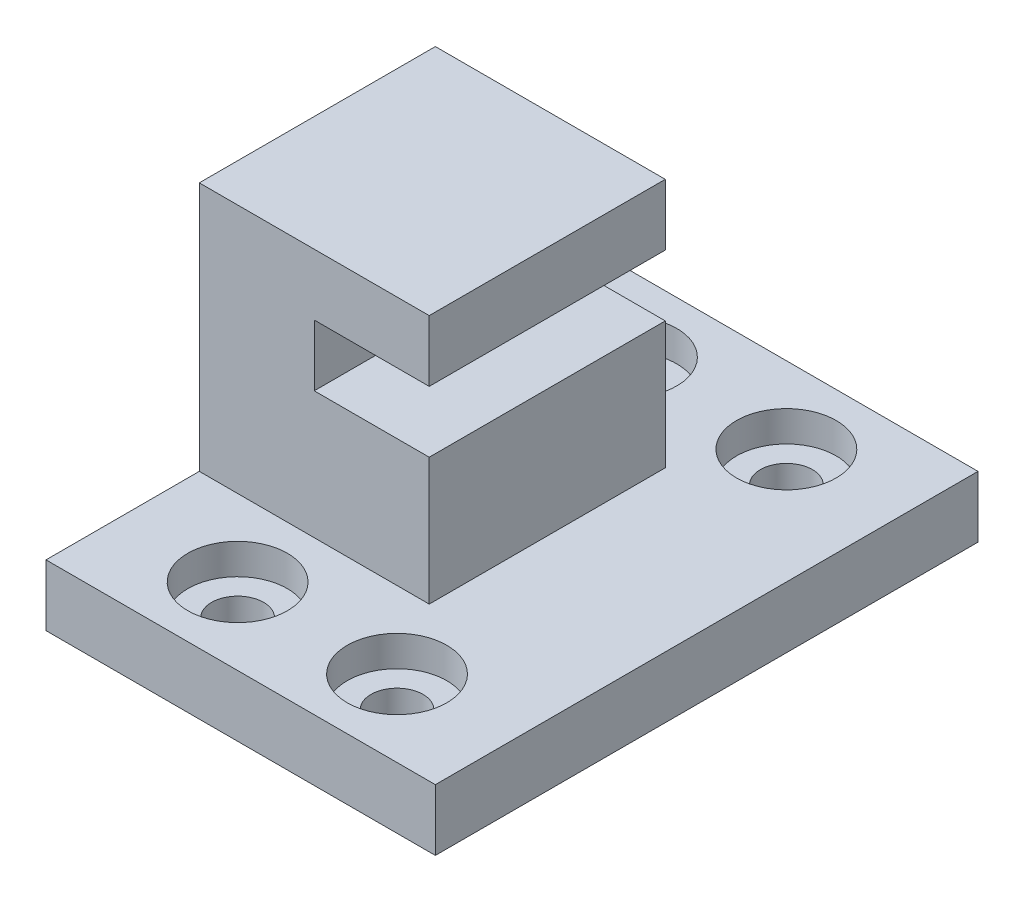
ISO-10303-21;
HEADER;
FILE_DESCRIPTION(('STEP AP214'),'2;1');
FILE_NAME('part.step','',(''),(''),'','','');
FILE_SCHEMA(('AUTOMOTIVE_DESIGN { 1 0 10303 214 1 1 1 1 }'));
ENDSEC;
DATA;
#1=APPLICATION_CONTEXT('core data for automotive mechanical design processes');
#2=APPLICATION_PROTOCOL_DEFINITION('international standard','automotive_design',2000,#1);
#3=PRODUCT_CONTEXT('',#1,'mechanical');
#4=PRODUCT('Part','Part','',(#3));
#5=PRODUCT_RELATED_PRODUCT_CATEGORY('part','',(#4));
#6=PRODUCT_DEFINITION_FORMATION('','',#4);
#7=PRODUCT_DEFINITION_CONTEXT('part definition',#1,'design');
#8=PRODUCT_DEFINITION('design','',#6,#7);
#9=PRODUCT_DEFINITION_SHAPE('','',#8);
#10=(LENGTH_UNIT() NAMED_UNIT(*) SI_UNIT(.MILLI.,.METRE.));
#11=(NAMED_UNIT(*) PLANE_ANGLE_UNIT() SI_UNIT($,.RADIAN.));
#12=(NAMED_UNIT(*) SI_UNIT($,.STERADIAN.) SOLID_ANGLE_UNIT());
#13=UNCERTAINTY_MEASURE_WITH_UNIT(LENGTH_MEASURE(1.E-05),#10,'distance_accuracy_value','');
#14=(GEOMETRIC_REPRESENTATION_CONTEXT(3) GLOBAL_UNCERTAINTY_ASSIGNED_CONTEXT((#13)) GLOBAL_UNIT_ASSIGNED_CONTEXT((#10,
#11,#12)) REPRESENTATION_CONTEXT('',''));
#15=CARTESIAN_POINT('',(0.,0.,0.));
#16=DIRECTION('',(0.,0.,1.));
#17=DIRECTION('',(1.,0.,0.));
#18=AXIS2_PLACEMENT_3D('',#15,#16,#17);
#19=CARTESIAN_POINT('',(2.3,20.3,-7.7));
#20=DIRECTION('',(-1.,0.,0.));
#21=DIRECTION('',(0.,0.,1.));
#22=AXIS2_PLACEMENT_3D('',#19,#20,#21);
#23=PLANE('',#22);
#24=DIRECTION('',(0.,-1.,0.));
#25=VECTOR('',#24,1.);
#26=CARTESIAN_POINT('',(2.3,20.3,-7.7));
#27=LINE('',#26,#25);
#28=CARTESIAN_POINT('',(2.3,12.3,-7.7));
#29=VERTEX_POINT('',#28);
#30=CARTESIAN_POINT('',(2.3,4.,-7.7));
#31=VERTEX_POINT('',#30);
#32=EDGE_CURVE('E64',#29,#31,#27,.T.);
#33=ORIENTED_EDGE('',*,*,#32,.F.);
#34=DIRECTION('',(0.,0.,1.));
#35=VECTOR('',#34,1.);
#36=CARTESIAN_POINT('',(2.3,12.3,-17.7));
#37=LINE('',#36,#35);
#38=CARTESIAN_POINT('',(2.3,12.3,7.7));
#39=VERTEX_POINT('',#38);
#40=EDGE_CURVE('E202',#29,#39,#37,.T.);
#41=ORIENTED_EDGE('',*,*,#40,.T.);
#42=DIRECTION('',(0.,-1.,0.));
#43=VECTOR('',#42,1.);
#44=CARTESIAN_POINT('',(2.3,20.3,7.7));
#45=LINE('',#44,#43);
#46=CARTESIAN_POINT('',(2.3,4.,7.7));
#47=VERTEX_POINT('',#46);
#48=EDGE_CURVE('E157',#39,#47,#45,.T.);
#49=ORIENTED_EDGE('',*,*,#48,.T.);
#50=DIRECTION('',(0.,0.,-1.));
#51=VECTOR('',#50,1.);
#52=CARTESIAN_POINT('',(2.3,4.,-7.7));
#53=LINE('',#52,#51);
#54=EDGE_CURVE('E222',#47,#31,#53,.T.);
#55=ORIENTED_EDGE('',*,*,#54,.T.);
#56=EDGE_LOOP('',(#33,#41,#49,#55));
#57=FACE_BOUND('',#56,.T.);
#58=ADVANCED_FACE('F42',(#57),#23,.F.);
#59=CARTESIAN_POINT('',(-12.7,4.,17.7));
#60=DIRECTION('',(1.,0.,0.));
#61=DIRECTION('',(0.,0.,-1.));
#62=AXIS2_PLACEMENT_3D('',#59,#60,#61);
#63=PLANE('',#62);
#64=DIRECTION('',(0.,0.,1.));
#65=VECTOR('',#64,1.);
#66=CARTESIAN_POINT('',(-12.7,0.,17.7));
#67=LINE('',#66,#65);
#68=CARTESIAN_POINT('',(-12.7,0.,-17.7));
#69=VERTEX_POINT('',#68);
#70=CARTESIAN_POINT('',(-12.7,0.,17.7));
#71=VERTEX_POINT('',#70);
#72=EDGE_CURVE('E160',#69,#71,#67,.T.);
#73=ORIENTED_EDGE('',*,*,#72,.T.);
#74=DIRECTION('',(0.,-1.,0.));
#75=VECTOR('',#74,1.);
#76=CARTESIAN_POINT('',(-12.7,4.,17.7));
#77=LINE('',#76,#75);
#78=CARTESIAN_POINT('',(-12.7,4.,17.7));
#79=VERTEX_POINT('',#78);
#80=EDGE_CURVE('E192',#79,#71,#77,.T.);
#81=ORIENTED_EDGE('',*,*,#80,.F.);
#82=DIRECTION('',(0.,0.,1.));
#83=VECTOR('',#82,1.);
#84=CARTESIAN_POINT('',(-12.7,4.,17.7));
#85=LINE('',#84,#83);
#86=CARTESIAN_POINT('',(-12.7,4.,7.7));
#87=VERTEX_POINT('',#86);
#88=EDGE_CURVE('E169',#87,#79,#85,.T.);
#89=ORIENTED_EDGE('',*,*,#88,.F.);
#90=DIRECTION('',(0.,-1.,0.));
#91=VECTOR('',#90,1.);
#92=CARTESIAN_POINT('',(-12.7,20.3,7.7));
#93=LINE('',#92,#91);
#94=CARTESIAN_POINT('',(-12.7,20.3,7.7));
#95=VERTEX_POINT('',#94);
#96=EDGE_CURVE('E156',#95,#87,#93,.T.);
#97=ORIENTED_EDGE('',*,*,#96,.F.);
#98=DIRECTION('',(0.,0.,1.));
#99=VECTOR('',#98,1.);
#100=CARTESIAN_POINT('',(-12.7,20.3,-7.7));
#101=LINE('',#100,#99);
#102=CARTESIAN_POINT('',(-12.7,20.3,-7.7));
#103=VERTEX_POINT('',#102);
#104=EDGE_CURVE('E210',#103,#95,#101,.T.);
#105=ORIENTED_EDGE('',*,*,#104,.F.);
#106=DIRECTION('',(0.,-1.,0.));
#107=VECTOR('',#106,1.);
#108=CARTESIAN_POINT('',(-12.7,20.3,-7.7));
#109=LINE('',#108,#107);
#110=CARTESIAN_POINT('',(-12.7,4.,-7.7));
#111=VERTEX_POINT('',#110);
#112=EDGE_CURVE('E219',#103,#111,#109,.T.);
#113=ORIENTED_EDGE('',*,*,#112,.T.);
#114=CARTESIAN_POINT('',(-12.7,4.,-17.7));
#115=VERTEX_POINT('',#114);
#116=EDGE_CURVE('E166',#115,#111,#85,.T.);
#117=ORIENTED_EDGE('',*,*,#116,.F.);
#118=DIRECTION('',(0.,-1.,0.));
#119=VECTOR('',#118,1.);
#120=CARTESIAN_POINT('',(-12.7,4.,-17.7));
#121=LINE('',#120,#119);
#122=EDGE_CURVE('E175',#115,#69,#121,.T.);
#123=ORIENTED_EDGE('',*,*,#122,.T.);
#124=EDGE_LOOP('',(#73,#81,#89,#97,#105,#113,#117,#123));
#125=FACE_BOUND('',#124,.T.);
#126=ADVANCED_FACE('F235',(#125),#63,.F.);
#127=CARTESIAN_POINT('',(-12.7,4.,17.7));
#128=DIRECTION('',(0.,0.,-1.));
#129=DIRECTION('',(-1.,0.,0.));
#130=AXIS2_PLACEMENT_3D('',#127,#128,#129);
#131=PLANE('',#130);
#132=DIRECTION('',(1.,0.,0.));
#133=VECTOR('',#132,1.);
#134=CARTESIAN_POINT('',(-12.7,0.,17.7));
#135=LINE('',#134,#133);
#136=CARTESIAN_POINT('',(12.7,0.,17.7));
#137=VERTEX_POINT('',#136);
#138=EDGE_CURVE('E178',#71,#137,#135,.T.);
#139=ORIENTED_EDGE('',*,*,#138,.T.);
#140=DIRECTION('',(0.,-1.,0.));
#141=VECTOR('',#140,1.);
#142=CARTESIAN_POINT('',(12.7,4.,17.7));
#143=LINE('',#142,#141);
#144=CARTESIAN_POINT('',(12.7,4.,17.7));
#145=VERTEX_POINT('',#144);
#146=EDGE_CURVE('E189',#145,#137,#143,.T.);
#147=ORIENTED_EDGE('',*,*,#146,.F.);
#148=DIRECTION('',(1.,0.,0.));
#149=VECTOR('',#148,1.);
#150=CARTESIAN_POINT('',(-12.7,4.,17.7));
#151=LINE('',#150,#149);
#152=EDGE_CURVE('E168',#79,#145,#151,.T.);
#153=ORIENTED_EDGE('',*,*,#152,.F.);
#154=ORIENTED_EDGE('',*,*,#80,.T.);
#155=EDGE_LOOP('',(#139,#147,#153,#154));
#156=FACE_BOUND('',#155,.T.);
#157=ADVANCED_FACE('F243',(#156),#131,.F.);
#158=CARTESIAN_POINT('',(12.7,4.,17.7));
#159=DIRECTION('',(-1.,0.,0.));
#160=DIRECTION('',(0.,0.,1.));
#161=AXIS2_PLACEMENT_3D('',#158,#159,#160);
#162=PLANE('',#161);
#163=DIRECTION('',(0.,0.,-1.));
#164=VECTOR('',#163,1.);
#165=CARTESIAN_POINT('',(12.7,0.,17.7));
#166=LINE('',#165,#164);
#167=CARTESIAN_POINT('',(12.7,0.,-17.7));
#168=VERTEX_POINT('',#167);
#169=EDGE_CURVE('E180',#137,#168,#166,.T.);
#170=ORIENTED_EDGE('',*,*,#169,.T.);
#171=DIRECTION('',(0.,-1.,0.));
#172=VECTOR('',#171,1.);
#173=CARTESIAN_POINT('',(12.7,4.,-17.7));
#174=LINE('',#173,#172);
#175=CARTESIAN_POINT('',(12.7,4.,-17.7));
#176=VERTEX_POINT('',#175);
#177=EDGE_CURVE('E186',#176,#168,#174,.T.);
#178=ORIENTED_EDGE('',*,*,#177,.F.);
#179=DIRECTION('',(0.,0.,-1.));
#180=VECTOR('',#179,1.);
#181=CARTESIAN_POINT('',(12.7,4.,17.7));
#182=LINE('',#181,#180);
#183=EDGE_CURVE('E171',#145,#176,#182,.T.);
#184=ORIENTED_EDGE('',*,*,#183,.F.);
#185=ORIENTED_EDGE('',*,*,#146,.T.);
#186=EDGE_LOOP('',(#170,#178,#184,#185));
#187=FACE_BOUND('',#186,.T.);
#188=ADVANCED_FACE('F248',(#187),#162,.F.);
#189=CARTESIAN_POINT('',(-12.7,4.,-17.7));
#190=DIRECTION('',(0.,0.,1.));
#191=DIRECTION('',(1.,0.,0.));
#192=AXIS2_PLACEMENT_3D('',#189,#190,#191);
#193=PLANE('',#192);
#194=DIRECTION('',(-1.,0.,0.));
#195=VECTOR('',#194,1.);
#196=CARTESIAN_POINT('',(-12.7,0.,-17.7));
#197=LINE('',#196,#195);
#198=EDGE_CURVE('E182',#168,#69,#197,.T.);
#199=ORIENTED_EDGE('',*,*,#198,.T.);
#200=ORIENTED_EDGE('',*,*,#122,.F.);
#201=DIRECTION('',(-1.,0.,0.));
#202=VECTOR('',#201,1.);
#203=CARTESIAN_POINT('',(-12.7,4.,-17.7));
#204=LINE('',#203,#202);
#205=EDGE_CURVE('E173',#176,#115,#204,.T.);
#206=ORIENTED_EDGE('',*,*,#205,.F.);
#207=ORIENTED_EDGE('',*,*,#177,.T.);
#208=EDGE_LOOP('',(#199,#200,#206,#207));
#209=FACE_BOUND('',#208,.T.);
#210=ADVANCED_FACE('F252',(#209),#193,.F.);
#211=CARTESIAN_POINT('',(0.,0.,0.));
#212=DIRECTION('',(0.,1.,0.));
#213=DIRECTION('',(0.,0.,1.));
#214=AXIS2_PLACEMENT_3D('',#211,#212,#213);
#215=PLANE('',#214);
#216=CARTESIAN_POINT('',(-5.2,0.,-12.7));
#217=DIRECTION('',(0.,1.,0.));
#218=DIRECTION('',(0.,0.,1.));
#219=AXIS2_PLACEMENT_3D('',#216,#217,#218);
#220=CIRCLE('',#219,1.7);
#221=CARTESIAN_POINT('',(-5.2,0.,-11.));
#222=VERTEX_POINT('',#221);
#223=EDGE_CURVE('E538',#222,#222,#220,.T.);
#224=ORIENTED_EDGE('',*,*,#223,.T.);
#225=EDGE_LOOP('',(#224));
#226=FACE_BOUND('',#225,.T.);
#227=CARTESIAN_POINT('',(-5.2,0.,12.7));
#228=DIRECTION('',(0.,1.,0.));
#229=DIRECTION('',(0.,0.,1.));
#230=AXIS2_PLACEMENT_3D('',#227,#228,#229);
#231=CIRCLE('',#230,1.7);
#232=CARTESIAN_POINT('',(-5.2,0.,14.4));
#233=VERTEX_POINT('',#232);
#234=EDGE_CURVE('E549',#233,#233,#231,.T.);
#235=ORIENTED_EDGE('',*,*,#234,.T.);
#236=EDGE_LOOP('',(#235));
#237=FACE_BOUND('',#236,.T.);
#238=CARTESIAN_POINT('',(5.2,0.,12.7));
#239=DIRECTION('',(0.,1.,0.));
#240=DIRECTION('',(0.,0.,1.));
#241=AXIS2_PLACEMENT_3D('',#238,#239,#240);
#242=CIRCLE('',#241,1.7);
#243=CARTESIAN_POINT('',(5.2,0.,14.4));
#244=VERTEX_POINT('',#243);
#245=EDGE_CURVE('E561',#244,#244,#242,.T.);
#246=ORIENTED_EDGE('',*,*,#245,.T.);
#247=EDGE_LOOP('',(#246));
#248=FACE_BOUND('',#247,.T.);
#249=CARTESIAN_POINT('',(5.2,0.,-12.7));
#250=DIRECTION('',(0.,1.,0.));
#251=DIRECTION('',(0.,0.,1.));
#252=AXIS2_PLACEMENT_3D('',#249,#250,#251);
#253=CIRCLE('',#252,1.7);
#254=CARTESIAN_POINT('',(5.2,0.,-11.));
#255=VERTEX_POINT('',#254);
#256=EDGE_CURVE('E152',#255,#255,#253,.T.);
#257=ORIENTED_EDGE('',*,*,#256,.T.);
#258=EDGE_LOOP('',(#257));
#259=FACE_BOUND('',#258,.T.);
#260=ORIENTED_EDGE('',*,*,#72,.F.);
#261=ORIENTED_EDGE('',*,*,#198,.F.);
#262=ORIENTED_EDGE('',*,*,#169,.F.);
#263=ORIENTED_EDGE('',*,*,#138,.F.);
#264=EDGE_LOOP('',(#260,#261,#262,#263));
#265=FACE_BOUND('',#264,.T.);
#266=ADVANCED_FACE('F44',(#226,#237,#248,#259,#265),#215,.F.);
#267=CARTESIAN_POINT('',(0.,4.,0.));
#268=DIRECTION('',(0.,1.,0.));
#269=DIRECTION('',(0.,0.,1.));
#270=AXIS2_PLACEMENT_3D('',#267,#268,#269);
#271=PLANE('',#270);
#272=CARTESIAN_POINT('',(-5.2,4.,-12.7));
#273=DIRECTION('',(0.,1.,0.));
#274=DIRECTION('',(0.,0.,1.));
#275=AXIS2_PLACEMENT_3D('',#272,#273,#274);
#276=CIRCLE('',#275,3.25);
#277=CARTESIAN_POINT('',(-5.2,4.,-9.45));
#278=VERTEX_POINT('',#277);
#279=EDGE_CURVE('E531',#278,#278,#276,.T.);
#280=ORIENTED_EDGE('',*,*,#279,.F.);
#281=EDGE_LOOP('',(#280));
#282=FACE_BOUND('',#281,.T.);
#283=CARTESIAN_POINT('',(-5.2,4.,12.7));
#284=DIRECTION('',(0.,1.,0.));
#285=DIRECTION('',(0.,0.,1.));
#286=AXIS2_PLACEMENT_3D('',#283,#284,#285);
#287=CIRCLE('',#286,3.25);
#288=CARTESIAN_POINT('',(-5.2,4.,15.95));
#289=VERTEX_POINT('',#288);
#290=EDGE_CURVE('E540',#289,#289,#287,.T.);
#291=ORIENTED_EDGE('',*,*,#290,.F.);
#292=EDGE_LOOP('',(#291));
#293=FACE_BOUND('',#292,.T.);
#294=CARTESIAN_POINT('',(5.2,4.,12.7));
#295=DIRECTION('',(0.,1.,0.));
#296=DIRECTION('',(0.,0.,1.));
#297=AXIS2_PLACEMENT_3D('',#294,#295,#296);
#298=CIRCLE('',#297,3.25);
#299=CARTESIAN_POINT('',(5.2,4.,15.95));
#300=VERTEX_POINT('',#299);
#301=EDGE_CURVE('E552',#300,#300,#298,.T.);
#302=ORIENTED_EDGE('',*,*,#301,.F.);
#303=EDGE_LOOP('',(#302));
#304=FACE_BOUND('',#303,.T.);
#305=CARTESIAN_POINT('',(5.2,4.,-12.7));
#306=DIRECTION('',(0.,1.,0.));
#307=DIRECTION('',(0.,0.,1.));
#308=AXIS2_PLACEMENT_3D('',#305,#306,#307);
#309=CIRCLE('',#308,3.25);
#310=CARTESIAN_POINT('',(5.2,4.,-9.45));
#311=VERTEX_POINT('',#310);
#312=EDGE_CURVE('E564',#311,#311,#309,.T.);
#313=ORIENTED_EDGE('',*,*,#312,.F.);
#314=EDGE_LOOP('',(#313));
#315=FACE_BOUND('',#314,.T.);
#316=DIRECTION('',(-1.,0.,0.));
#317=VECTOR('',#316,1.);
#318=CARTESIAN_POINT('',(-12.7,4.,-7.7));
#319=LINE('',#318,#317);
#320=EDGE_CURVE('E214',#31,#111,#319,.T.);
#321=ORIENTED_EDGE('',*,*,#320,.F.);
#322=ORIENTED_EDGE('',*,*,#54,.F.);
#323=DIRECTION('',(1.,0.,0.));
#324=VECTOR('',#323,1.);
#325=CARTESIAN_POINT('',(-12.7,4.,7.7));
#326=LINE('',#325,#324);
#327=EDGE_CURVE('E205',#87,#47,#326,.T.);
#328=ORIENTED_EDGE('',*,*,#327,.F.);
#329=ORIENTED_EDGE('',*,*,#88,.T.);
#330=ORIENTED_EDGE('',*,*,#152,.T.);
#331=ORIENTED_EDGE('',*,*,#183,.T.);
#332=ORIENTED_EDGE('',*,*,#205,.T.);
#333=ORIENTED_EDGE('',*,*,#116,.T.);
#334=EDGE_LOOP('',(#321,#322,#328,#329,#330,#331,#332,#333));
#335=FACE_BOUND('',#334,.T.);
#336=ADVANCED_FACE('F239',(#282,#293,#304,#315,#335),#271,.T.);
#337=CARTESIAN_POINT('',(-12.7,20.3,7.7));
#338=DIRECTION('',(0.,0.,-1.));
#339=DIRECTION('',(-1.,0.,0.));
#340=AXIS2_PLACEMENT_3D('',#337,#338,#339);
#341=PLANE('',#340);
#342=ORIENTED_EDGE('',*,*,#48,.F.);
#343=DIRECTION('',(1.,0.,0.));
#344=VECTOR('',#343,1.);
#345=CARTESIAN_POINT('',(2.3,12.3,7.7));
#346=LINE('',#345,#344);
#347=CARTESIAN_POINT('',(-5.2,12.3,7.7));
#348=VERTEX_POINT('',#347);
#349=EDGE_CURVE('E141',#348,#39,#346,.T.);
#350=ORIENTED_EDGE('',*,*,#349,.F.);
#351=DIRECTION('',(0.,-1.,0.));
#352=VECTOR('',#351,1.);
#353=CARTESIAN_POINT('',(-5.2,16.3,7.7));
#354=LINE('',#353,#352);
#355=CARTESIAN_POINT('',(-5.2,16.3,7.7));
#356=VERTEX_POINT('',#355);
#357=EDGE_CURVE('E151',#356,#348,#354,.T.);
#358=ORIENTED_EDGE('',*,*,#357,.F.);
#359=DIRECTION('',(-1.,0.,0.));
#360=VECTOR('',#359,1.);
#361=CARTESIAN_POINT('',(2.3,16.3,7.7));
#362=LINE('',#361,#360);
#363=CARTESIAN_POINT('',(2.3,16.3,7.7));
#364=VERTEX_POINT('',#363);
#365=EDGE_CURVE('E133',#364,#356,#362,.T.);
#366=ORIENTED_EDGE('',*,*,#365,.F.);
#367=CARTESIAN_POINT('',(2.3,20.3,7.7));
#368=VERTEX_POINT('',#367);
#369=EDGE_CURVE('E147',#368,#364,#45,.T.);
#370=ORIENTED_EDGE('',*,*,#369,.F.);
#371=DIRECTION('',(1.,0.,0.));
#372=VECTOR('',#371,1.);
#373=CARTESIAN_POINT('',(-12.7,20.3,7.7));
#374=LINE('',#373,#372);
#375=EDGE_CURVE('E213',#95,#368,#374,.T.);
#376=ORIENTED_EDGE('',*,*,#375,.F.);
#377=ORIENTED_EDGE('',*,*,#96,.T.);
#378=ORIENTED_EDGE('',*,*,#327,.T.);
#379=EDGE_LOOP('',(#342,#350,#358,#366,#370,#376,#377,#378));
#380=FACE_BOUND('',#379,.T.);
#381=ADVANCED_FACE('F146',(#380),#341,.F.);
#382=ORIENTED_EDGE('',*,*,#369,.T.);
#383=DIRECTION('',(0.,0.,1.));
#384=VECTOR('',#383,1.);
#385=CARTESIAN_POINT('',(2.3,16.3,-17.7));
#386=LINE('',#385,#384);
#387=CARTESIAN_POINT('',(2.3,16.3,-7.7));
#388=VERTEX_POINT('',#387);
#389=EDGE_CURVE('E130',#388,#364,#386,.T.);
#390=ORIENTED_EDGE('',*,*,#389,.F.);
#391=CARTESIAN_POINT('',(2.3,20.3,-7.7));
#392=VERTEX_POINT('',#391);
#393=EDGE_CURVE('E162',#392,#388,#27,.T.);
#394=ORIENTED_EDGE('',*,*,#393,.F.);
#395=DIRECTION('',(0.,0.,-1.));
#396=VECTOR('',#395,1.);
#397=CARTESIAN_POINT('',(2.3,20.3,-7.7));
#398=LINE('',#397,#396);
#399=EDGE_CURVE('E155',#368,#392,#398,.T.);
#400=ORIENTED_EDGE('',*,*,#399,.F.);
#401=EDGE_LOOP('',(#382,#390,#394,#400));
#402=FACE_BOUND('',#401,.T.);
#403=ADVANCED_FACE('F154',(#402),#23,.F.);
#404=CARTESIAN_POINT('',(-12.7,20.3,-7.7));
#405=DIRECTION('',(0.,0.,1.));
#406=DIRECTION('',(1.,0.,0.));
#407=AXIS2_PLACEMENT_3D('',#404,#405,#406);
#408=PLANE('',#407);
#409=DIRECTION('',(0.,-1.,0.));
#410=VECTOR('',#409,1.);
#411=CARTESIAN_POINT('',(-5.2,20.3,-7.7));
#412=LINE('',#411,#410);
#413=CARTESIAN_POINT('',(-5.2,16.3,-7.7));
#414=VERTEX_POINT('',#413);
#415=CARTESIAN_POINT('',(-5.2,12.3,-7.7));
#416=VERTEX_POINT('',#415);
#417=EDGE_CURVE('E50',#414,#416,#412,.T.);
#418=ORIENTED_EDGE('',*,*,#417,.T.);
#419=DIRECTION('',(1.,0.,0.));
#420=VECTOR('',#419,1.);
#421=CARTESIAN_POINT('',(-12.7,12.3,-7.7));
#422=LINE('',#421,#420);
#423=EDGE_CURVE('E11',#416,#29,#422,.T.);
#424=ORIENTED_EDGE('',*,*,#423,.T.);
#425=ORIENTED_EDGE('',*,*,#32,.T.);
#426=ORIENTED_EDGE('',*,*,#320,.T.);
#427=ORIENTED_EDGE('',*,*,#112,.F.);
#428=DIRECTION('',(-1.,0.,0.));
#429=VECTOR('',#428,1.);
#430=CARTESIAN_POINT('',(-12.7,20.3,-7.7));
#431=LINE('',#430,#429);
#432=EDGE_CURVE('E217',#392,#103,#431,.T.);
#433=ORIENTED_EDGE('',*,*,#432,.F.);
#434=ORIENTED_EDGE('',*,*,#393,.T.);
#435=DIRECTION('',(-1.,0.,0.));
#436=VECTOR('',#435,1.);
#437=CARTESIAN_POINT('',(-12.7,16.3,-7.7));
#438=LINE('',#437,#436);
#439=EDGE_CURVE('E136',#388,#414,#438,.T.);
#440=ORIENTED_EDGE('',*,*,#439,.T.);
#441=EDGE_LOOP('',(#418,#424,#425,#426,#427,#433,#434,#440));
#442=FACE_BOUND('',#441,.T.);
#443=ADVANCED_FACE('F196',(#442),#408,.F.);
#444=CARTESIAN_POINT('',(0.,20.3,0.));
#445=DIRECTION('',(0.,1.,0.));
#446=DIRECTION('',(0.,0.,1.));
#447=AXIS2_PLACEMENT_3D('',#444,#445,#446);
#448=PLANE('',#447);
#449=ORIENTED_EDGE('',*,*,#104,.T.);
#450=ORIENTED_EDGE('',*,*,#375,.T.);
#451=ORIENTED_EDGE('',*,*,#399,.T.);
#452=ORIENTED_EDGE('',*,*,#432,.T.);
#453=EDGE_LOOP('',(#449,#450,#451,#452));
#454=FACE_BOUND('',#453,.T.);
#455=ADVANCED_FACE('F232',(#454),#448,.T.);
#456=CARTESIAN_POINT('',(2.3,12.3,-17.7));
#457=DIRECTION('',(0.,-1.,0.));
#458=DIRECTION('',(1.,0.,0.));
#459=AXIS2_PLACEMENT_3D('',#456,#457,#458);
#460=PLANE('',#459);
#461=DIRECTION('',(0.,0.,1.));
#462=VECTOR('',#461,1.);
#463=CARTESIAN_POINT('',(-5.2,12.3,-17.7));
#464=LINE('',#463,#462);
#465=EDGE_CURVE('E200',#416,#348,#464,.T.);
#466=ORIENTED_EDGE('',*,*,#465,.T.);
#467=ORIENTED_EDGE('',*,*,#349,.T.);
#468=ORIENTED_EDGE('',*,*,#40,.F.);
#469=ORIENTED_EDGE('',*,*,#423,.F.);
#470=EDGE_LOOP('',(#466,#467,#468,#469));
#471=FACE_BOUND('',#470,.T.);
#472=ADVANCED_FACE('F315',(#471),#460,.F.);
#473=CARTESIAN_POINT('',(-5.2,16.3,-17.7));
#474=DIRECTION('',(-1.,0.,0.));
#475=DIRECTION('',(0.,0.,1.));
#476=AXIS2_PLACEMENT_3D('',#473,#474,#475);
#477=PLANE('',#476);
#478=DIRECTION('',(0.,0.,1.));
#479=VECTOR('',#478,1.);
#480=CARTESIAN_POINT('',(-5.2,16.3,-17.7));
#481=LINE('',#480,#479);
#482=EDGE_CURVE('E57',#414,#356,#481,.T.);
#483=ORIENTED_EDGE('',*,*,#482,.T.);
#484=ORIENTED_EDGE('',*,*,#357,.T.);
#485=ORIENTED_EDGE('',*,*,#465,.F.);
#486=ORIENTED_EDGE('',*,*,#417,.F.);
#487=EDGE_LOOP('',(#483,#484,#485,#486));
#488=FACE_BOUND('',#487,.T.);
#489=ADVANCED_FACE('F199',(#488),#477,.F.);
#490=CARTESIAN_POINT('',(2.3,16.3,-17.7));
#491=DIRECTION('',(0.,1.,0.));
#492=DIRECTION('',(0.,0.,1.));
#493=AXIS2_PLACEMENT_3D('',#490,#491,#492);
#494=PLANE('',#493);
#495=ORIENTED_EDGE('',*,*,#389,.T.);
#496=ORIENTED_EDGE('',*,*,#365,.T.);
#497=ORIENTED_EDGE('',*,*,#482,.F.);
#498=ORIENTED_EDGE('',*,*,#439,.F.);
#499=EDGE_LOOP('',(#495,#496,#497,#498));
#500=FACE_BOUND('',#499,.T.);
#501=ADVANCED_FACE('F132',(#500),#494,.F.);
#502=CARTESIAN_POINT('',(5.2,4.,-12.7));
#503=DIRECTION('',(0.,1.,0.));
#504=DIRECTION('',(0.,0.,1.));
#505=AXIS2_PLACEMENT_3D('',#502,#503,#504);
#506=CYLINDRICAL_SURFACE('',#505,1.7);
#507=ORIENTED_EDGE('',*,*,#256,.F.);
#508=EDGE_LOOP('',(#507));
#509=FACE_BOUND('',#508,.T.);
#510=CARTESIAN_POINT('',(5.2,2.,-12.7));
#511=DIRECTION('',(0.,1.,0.));
#512=DIRECTION('',(0.,0.,1.));
#513=AXIS2_PLACEMENT_3D('',#510,#511,#512);
#514=CIRCLE('',#513,1.7);
#515=CARTESIAN_POINT('',(5.2,2.,-11.));
#516=VERTEX_POINT('',#515);
#517=EDGE_CURVE('E570',#516,#516,#514,.T.);
#518=ORIENTED_EDGE('',*,*,#517,.T.);
#519=EDGE_LOOP('',(#518));
#520=FACE_BOUND('',#519,.T.);
#521=ADVANCED_FACE('F363',(#509,#520),#506,.F.);
#522=CARTESIAN_POINT('',(6.9,2.,-12.7));
#523=DIRECTION('',(0.,-1.,0.));
#524=DIRECTION('',(0.,0.,-1.));
#525=AXIS2_PLACEMENT_3D('',#522,#523,#524);
#526=PLANE('',#525);
#527=ORIENTED_EDGE('',*,*,#517,.F.);
#528=EDGE_LOOP('',(#527));
#529=FACE_BOUND('',#528,.T.);
#530=CARTESIAN_POINT('',(5.2,2.,-12.7));
#531=DIRECTION('',(0.,1.,0.));
#532=DIRECTION('',(0.,0.,1.));
#533=AXIS2_PLACEMENT_3D('',#530,#531,#532);
#534=CIRCLE('',#533,3.25);
#535=CARTESIAN_POINT('',(5.2,2.,-9.45));
#536=VERTEX_POINT('',#535);
#537=EDGE_CURVE('E567',#536,#536,#534,.T.);
#538=ORIENTED_EDGE('',*,*,#537,.T.);
#539=EDGE_LOOP('',(#538));
#540=FACE_BOUND('',#539,.T.);
#541=ADVANCED_FACE('F384',(#529,#540),#526,.F.);
#542=CARTESIAN_POINT('',(5.2,4.,-12.7));
#543=DIRECTION('',(0.,1.,0.));
#544=DIRECTION('',(0.,0.,1.));
#545=AXIS2_PLACEMENT_3D('',#542,#543,#544);
#546=CYLINDRICAL_SURFACE('',#545,3.25);
#547=ORIENTED_EDGE('',*,*,#537,.F.);
#548=EDGE_LOOP('',(#547));
#549=FACE_BOUND('',#548,.T.);
#550=ORIENTED_EDGE('',*,*,#312,.T.);
#551=EDGE_LOOP('',(#550));
#552=FACE_BOUND('',#551,.T.);
#553=ADVANCED_FACE('F395',(#549,#552),#546,.F.);
#554=CARTESIAN_POINT('',(5.2,4.,12.7));
#555=DIRECTION('',(0.,1.,0.));
#556=DIRECTION('',(0.,0.,1.));
#557=AXIS2_PLACEMENT_3D('',#554,#555,#556);
#558=CYLINDRICAL_SURFACE('',#557,1.7);
#559=ORIENTED_EDGE('',*,*,#245,.F.);
#560=EDGE_LOOP('',(#559));
#561=FACE_BOUND('',#560,.T.);
#562=CARTESIAN_POINT('',(5.2,2.,12.7));
#563=DIRECTION('',(0.,1.,0.));
#564=DIRECTION('',(0.,0.,1.));
#565=AXIS2_PLACEMENT_3D('',#562,#563,#564);
#566=CIRCLE('',#565,1.7);
#567=CARTESIAN_POINT('',(5.2,2.,14.4));
#568=VERTEX_POINT('',#567);
#569=EDGE_CURVE('E558',#568,#568,#566,.T.);
#570=ORIENTED_EDGE('',*,*,#569,.T.);
#571=EDGE_LOOP('',(#570));
#572=FACE_BOUND('',#571,.T.);
#573=ADVANCED_FACE('F406',(#561,#572),#558,.F.);
#574=CARTESIAN_POINT('',(6.9,2.,12.7));
#575=DIRECTION('',(0.,-1.,0.));
#576=DIRECTION('',(0.,0.,-1.));
#577=AXIS2_PLACEMENT_3D('',#574,#575,#576);
#578=PLANE('',#577);
#579=ORIENTED_EDGE('',*,*,#569,.F.);
#580=EDGE_LOOP('',(#579));
#581=FACE_BOUND('',#580,.T.);
#582=CARTESIAN_POINT('',(5.2,2.,12.7));
#583=DIRECTION('',(0.,1.,0.));
#584=DIRECTION('',(0.,0.,1.));
#585=AXIS2_PLACEMENT_3D('',#582,#583,#584);
#586=CIRCLE('',#585,3.25);
#587=CARTESIAN_POINT('',(5.2,2.,15.95));
#588=VERTEX_POINT('',#587);
#589=EDGE_CURVE('E555',#588,#588,#586,.T.);
#590=ORIENTED_EDGE('',*,*,#589,.T.);
#591=EDGE_LOOP('',(#590));
#592=FACE_BOUND('',#591,.T.);
#593=ADVANCED_FACE('F417',(#581,#592),#578,.F.);
#594=CARTESIAN_POINT('',(5.2,4.,12.7));
#595=DIRECTION('',(0.,1.,0.));
#596=DIRECTION('',(0.,0.,1.));
#597=AXIS2_PLACEMENT_3D('',#594,#595,#596);
#598=CYLINDRICAL_SURFACE('',#597,3.25);
#599=ORIENTED_EDGE('',*,*,#589,.F.);
#600=EDGE_LOOP('',(#599));
#601=FACE_BOUND('',#600,.T.);
#602=ORIENTED_EDGE('',*,*,#301,.T.);
#603=EDGE_LOOP('',(#602));
#604=FACE_BOUND('',#603,.T.);
#605=ADVANCED_FACE('F428',(#601,#604),#598,.F.);
#606=CARTESIAN_POINT('',(-5.2,4.,12.7));
#607=DIRECTION('',(0.,1.,0.));
#608=DIRECTION('',(0.,0.,1.));
#609=AXIS2_PLACEMENT_3D('',#606,#607,#608);
#610=CYLINDRICAL_SURFACE('',#609,1.7);
#611=ORIENTED_EDGE('',*,*,#234,.F.);
#612=EDGE_LOOP('',(#611));
#613=FACE_BOUND('',#612,.T.);
#614=CARTESIAN_POINT('',(-5.2,2.,12.7));
#615=DIRECTION('',(0.,1.,0.));
#616=DIRECTION('',(0.,0.,1.));
#617=AXIS2_PLACEMENT_3D('',#614,#615,#616);
#618=CIRCLE('',#617,1.7);
#619=CARTESIAN_POINT('',(-5.2,2.,14.4));
#620=VERTEX_POINT('',#619);
#621=EDGE_CURVE('E546',#620,#620,#618,.T.);
#622=ORIENTED_EDGE('',*,*,#621,.T.);
#623=EDGE_LOOP('',(#622));
#624=FACE_BOUND('',#623,.T.);
#625=ADVANCED_FACE('F439',(#613,#624),#610,.F.);
#626=CARTESIAN_POINT('',(-3.5,2.,12.7));
#627=DIRECTION('',(0.,-1.,0.));
#628=DIRECTION('',(0.,0.,-1.));
#629=AXIS2_PLACEMENT_3D('',#626,#627,#628);
#630=PLANE('',#629);
#631=ORIENTED_EDGE('',*,*,#621,.F.);
#632=EDGE_LOOP('',(#631));
#633=FACE_BOUND('',#632,.T.);
#634=CARTESIAN_POINT('',(-5.2,2.,12.7));
#635=DIRECTION('',(0.,1.,0.));
#636=DIRECTION('',(0.,0.,1.));
#637=AXIS2_PLACEMENT_3D('',#634,#635,#636);
#638=CIRCLE('',#637,3.25);
#639=CARTESIAN_POINT('',(-5.2,2.,15.95));
#640=VERTEX_POINT('',#639);
#641=EDGE_CURVE('E543',#640,#640,#638,.T.);
#642=ORIENTED_EDGE('',*,*,#641,.T.);
#643=EDGE_LOOP('',(#642));
#644=FACE_BOUND('',#643,.T.);
#645=ADVANCED_FACE('F450',(#633,#644),#630,.F.);
#646=CARTESIAN_POINT('',(-5.2,4.,12.7));
#647=DIRECTION('',(0.,1.,0.));
#648=DIRECTION('',(0.,0.,1.));
#649=AXIS2_PLACEMENT_3D('',#646,#647,#648);
#650=CYLINDRICAL_SURFACE('',#649,3.25);
#651=ORIENTED_EDGE('',*,*,#641,.F.);
#652=EDGE_LOOP('',(#651));
#653=FACE_BOUND('',#652,.T.);
#654=ORIENTED_EDGE('',*,*,#290,.T.);
#655=EDGE_LOOP('',(#654));
#656=FACE_BOUND('',#655,.T.);
#657=ADVANCED_FACE('F461',(#653,#656),#650,.F.);
#658=CARTESIAN_POINT('',(-5.2,4.,-12.7));
#659=DIRECTION('',(0.,1.,0.));
#660=DIRECTION('',(0.,0.,1.));
#661=AXIS2_PLACEMENT_3D('',#658,#659,#660);
#662=CYLINDRICAL_SURFACE('',#661,1.7);
#663=ORIENTED_EDGE('',*,*,#223,.F.);
#664=EDGE_LOOP('',(#663));
#665=FACE_BOUND('',#664,.T.);
#666=CARTESIAN_POINT('',(-5.2,2.,-12.7));
#667=DIRECTION('',(0.,1.,0.));
#668=DIRECTION('',(0.,0.,1.));
#669=AXIS2_PLACEMENT_3D('',#666,#667,#668);
#670=CIRCLE('',#669,1.7);
#671=CARTESIAN_POINT('',(-5.2,2.,-11.));
#672=VERTEX_POINT('',#671);
#673=EDGE_CURVE('E533',#672,#672,#670,.T.);
#674=ORIENTED_EDGE('',*,*,#673,.T.);
#675=EDGE_LOOP('',(#674));
#676=FACE_BOUND('',#675,.T.);
#677=ADVANCED_FACE('F472',(#665,#676),#662,.F.);
#678=CARTESIAN_POINT('',(-3.5,2.,-12.7));
#679=DIRECTION('',(0.,-1.,0.));
#680=DIRECTION('',(0.,0.,-1.));
#681=AXIS2_PLACEMENT_3D('',#678,#679,#680);
#682=PLANE('',#681);
#683=ORIENTED_EDGE('',*,*,#673,.F.);
#684=EDGE_LOOP('',(#683));
#685=FACE_BOUND('',#684,.T.);
#686=CARTESIAN_POINT('',(-5.2,2.,-12.7));
#687=DIRECTION('',(0.,1.,0.));
#688=DIRECTION('',(0.,0.,1.));
#689=AXIS2_PLACEMENT_3D('',#686,#687,#688);
#690=CIRCLE('',#689,3.25);
#691=CARTESIAN_POINT('',(-5.2,2.,-9.45));
#692=VERTEX_POINT('',#691);
#693=EDGE_CURVE('E528',#692,#692,#690,.T.);
#694=ORIENTED_EDGE('',*,*,#693,.T.);
#695=EDGE_LOOP('',(#694));
#696=FACE_BOUND('',#695,.T.);
#697=ADVANCED_FACE('F483',(#685,#696),#682,.F.);
#698=CARTESIAN_POINT('',(-5.2,4.,-12.7));
#699=DIRECTION('',(0.,1.,0.));
#700=DIRECTION('',(0.,0.,1.));
#701=AXIS2_PLACEMENT_3D('',#698,#699,#700);
#702=CYLINDRICAL_SURFACE('',#701,3.25);
#703=ORIENTED_EDGE('',*,*,#693,.F.);
#704=EDGE_LOOP('',(#703));
#705=FACE_BOUND('',#704,.T.);
#706=ORIENTED_EDGE('',*,*,#279,.T.);
#707=EDGE_LOOP('',(#706));
#708=FACE_BOUND('',#707,.T.);
#709=ADVANCED_FACE('F494',(#705,#708),#702,.F.);
#710=CLOSED_SHELL('',(#58,#126,#157,#188,#210,#266,#336,#381,#403,#443,#455,#472,#489,#501,#521,
#541,#553,#573,#593,#605,#625,#645,#657,#677,#697,#709));
#711=MANIFOLD_SOLID_BREP('B2',#710);
#712=ADVANCED_BREP_SHAPE_REPRESENTATION('',(#18,#711),#14);
#713=SHAPE_DEFINITION_REPRESENTATION(#9,#712);
ENDSEC;
END-ISO-10303-21;
